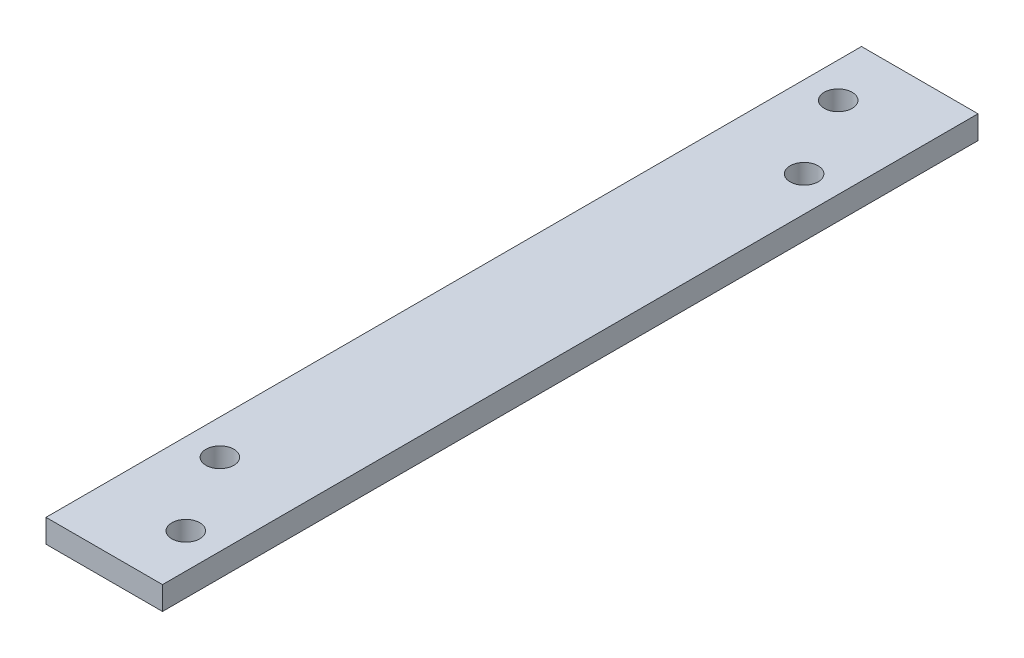
ISO-10303-21;
HEADER;
FILE_DESCRIPTION(('STEP AP214'),'2;1');
FILE_NAME('part.step','',(''),(''),'','','');
FILE_SCHEMA(('AUTOMOTIVE_DESIGN { 1 0 10303 214 1 1 1 1 }'));
ENDSEC;
DATA;
#1=APPLICATION_CONTEXT('core data for automotive mechanical design processes');
#2=APPLICATION_PROTOCOL_DEFINITION('international standard','automotive_design',2000,#1);
#3=PRODUCT_CONTEXT('',#1,'mechanical');
#4=PRODUCT('Part','Part','',(#3));
#5=PRODUCT_RELATED_PRODUCT_CATEGORY('part','',(#4));
#6=PRODUCT_DEFINITION_FORMATION('','',#4);
#7=PRODUCT_DEFINITION_CONTEXT('part definition',#1,'design');
#8=PRODUCT_DEFINITION('design','',#6,#7);
#9=PRODUCT_DEFINITION_SHAPE('','',#8);
#10=(LENGTH_UNIT() NAMED_UNIT(*) SI_UNIT(.MILLI.,.METRE.));
#11=(NAMED_UNIT(*) PLANE_ANGLE_UNIT() SI_UNIT($,.RADIAN.));
#12=(NAMED_UNIT(*) SI_UNIT($,.STERADIAN.) SOLID_ANGLE_UNIT());
#13=UNCERTAINTY_MEASURE_WITH_UNIT(LENGTH_MEASURE(1.E-05),#10,'distance_accuracy_value','');
#14=(GEOMETRIC_REPRESENTATION_CONTEXT(3) GLOBAL_UNCERTAINTY_ASSIGNED_CONTEXT((#13)) GLOBAL_UNIT_ASSIGNED_CONTEXT((#10,
#11,#12)) REPRESENTATION_CONTEXT('',''));
#15=CARTESIAN_POINT('',(0.,0.,0.));
#16=DIRECTION('',(0.,0.,1.));
#17=DIRECTION('',(1.,0.,0.));
#18=AXIS2_PLACEMENT_3D('',#15,#16,#17);
#19=CARTESIAN_POINT('',(0.,2.54,0.));
#20=DIRECTION('',(0.,-1.,0.));
#21=DIRECTION('',(0.,0.,-1.));
#22=AXIS2_PLACEMENT_3D('',#19,#20,#21);
#23=PLANE('',#22);
#24=DIRECTION('',(0.,0.,1.));
#25=VECTOR('',#24,1.);
#26=CARTESIAN_POINT('',(0.,2.54,0.));
#27=LINE('',#26,#25);
#28=CARTESIAN_POINT('',(0.,2.54,-88.9));
#29=VERTEX_POINT('',#28);
#30=CARTESIAN_POINT('',(0.,2.54,0.));
#31=VERTEX_POINT('',#30);
#32=EDGE_CURVE('E96',#29,#31,#27,.T.);
#33=ORIENTED_EDGE('',*,*,#32,.T.);
#34=DIRECTION('',(1.,0.,0.));
#35=VECTOR('',#34,1.);
#36=CARTESIAN_POINT('',(0.,2.54,0.));
#37=LINE('',#36,#35);
#38=CARTESIAN_POINT('',(12.7,2.54,0.));
#39=VERTEX_POINT('',#38);
#40=EDGE_CURVE('E91',#31,#39,#37,.T.);
#41=ORIENTED_EDGE('',*,*,#40,.T.);
#42=DIRECTION('',(0.,0.,-1.));
#43=VECTOR('',#42,1.);
#44=CARTESIAN_POINT('',(12.7,2.54,0.));
#45=LINE('',#44,#43);
#46=CARTESIAN_POINT('',(12.7,2.54,-88.9));
#47=VERTEX_POINT('',#46);
#48=EDGE_CURVE('E94',#39,#47,#45,.T.);
#49=ORIENTED_EDGE('',*,*,#48,.T.);
#50=DIRECTION('',(-1.,0.,0.));
#51=VECTOR('',#50,1.);
#52=CARTESIAN_POINT('',(0.,2.54,-88.9));
#53=LINE('',#52,#51);
#54=EDGE_CURVE('E61',#47,#29,#53,.T.);
#55=ORIENTED_EDGE('',*,*,#54,.T.);
#56=EDGE_LOOP('',(#33,#41,#49,#55));
#57=FACE_BOUND('',#56,.T.);
#58=CARTESIAN_POINT('',(3.81,2.54,-82.55));
#59=DIRECTION('',(0.,1.,0.));
#60=DIRECTION('',(0.,0.,1.));
#61=AXIS2_PLACEMENT_3D('',#58,#59,#60);
#62=CIRCLE('',#61,1.524);
#63=CARTESIAN_POINT('',(3.81,2.54,-81.026));
#64=VERTEX_POINT('',#63);
#65=EDGE_CURVE('E116',#64,#64,#62,.T.);
#66=ORIENTED_EDGE('',*,*,#65,.F.);
#67=EDGE_LOOP('',(#66));
#68=FACE_BOUND('',#67,.T.);
#69=CARTESIAN_POINT('',(8.89,2.54,-73.7511818975501));
#70=DIRECTION('',(0.,1.,0.));
#71=DIRECTION('',(0.,0.,1.));
#72=AXIS2_PLACEMENT_3D('',#69,#70,#71);
#73=CIRCLE('',#72,1.524);
#74=CARTESIAN_POINT('',(8.89,2.54,-72.2271818975501));
#75=VERTEX_POINT('',#74);
#76=EDGE_CURVE('E138',#75,#75,#73,.T.);
#77=ORIENTED_EDGE('',*,*,#76,.F.);
#78=EDGE_LOOP('',(#77));
#79=FACE_BOUND('',#78,.T.);
#80=CARTESIAN_POINT('',(8.89000000000391,2.54,-6.34999999999956));
#81=DIRECTION('',(0.,1.,0.));
#82=DIRECTION('',(0.,0.,1.));
#83=AXIS2_PLACEMENT_3D('',#80,#81,#82);
#84=CIRCLE('',#83,1.524);
#85=CARTESIAN_POINT('',(8.89000000000391,2.54,-4.82599999999957));
#86=VERTEX_POINT('',#85);
#87=EDGE_CURVE('E146',#86,#86,#84,.T.);
#88=ORIENTED_EDGE('',*,*,#87,.F.);
#89=EDGE_LOOP('',(#88));
#90=FACE_BOUND('',#89,.T.);
#91=CARTESIAN_POINT('',(3.81000000000397,2.54,-15.1488181024495));
#92=DIRECTION('',(0.,1.,0.));
#93=DIRECTION('',(0.,0.,1.));
#94=AXIS2_PLACEMENT_3D('',#91,#92,#93);
#95=CIRCLE('',#94,1.524);
#96=CARTESIAN_POINT('',(3.81000000000397,2.54,-13.6248181024495));
#97=VERTEX_POINT('',#96);
#98=EDGE_CURVE('E154',#97,#97,#95,.T.);
#99=ORIENTED_EDGE('',*,*,#98,.F.);
#100=EDGE_LOOP('',(#99));
#101=FACE_BOUND('',#100,.T.);
#102=ADVANCED_FACE('F43',(#57,#68,#79,#90,#101),#23,.F.);
#103=CARTESIAN_POINT('',(0.,0.,0.));
#104=DIRECTION('',(0.,-1.,0.));
#105=DIRECTION('',(0.,0.,-1.));
#106=AXIS2_PLACEMENT_3D('',#103,#104,#105);
#107=PLANE('',#106);
#108=CARTESIAN_POINT('',(8.89000000000391,0.,-6.34999999999956));
#109=DIRECTION('',(0.,1.,0.));
#110=DIRECTION('',(0.,0.,1.));
#111=AXIS2_PLACEMENT_3D('',#108,#109,#110);
#112=CIRCLE('',#111,1.524);
#113=CARTESIAN_POINT('',(8.89000000000391,0.,-4.82599999999957));
#114=VERTEX_POINT('',#113);
#115=EDGE_CURVE('E150',#114,#114,#112,.T.);
#116=ORIENTED_EDGE('',*,*,#115,.T.);
#117=EDGE_LOOP('',(#116));
#118=FACE_BOUND('',#117,.T.);
#119=CARTESIAN_POINT('',(3.81,0.,-82.55));
#120=DIRECTION('',(0.,1.,0.));
#121=DIRECTION('',(0.,0.,1.));
#122=AXIS2_PLACEMENT_3D('',#119,#120,#121);
#123=CIRCLE('',#122,1.524);
#124=CARTESIAN_POINT('',(3.81,0.,-81.026));
#125=VERTEX_POINT('',#124);
#126=EDGE_CURVE('E134',#125,#125,#123,.T.);
#127=ORIENTED_EDGE('',*,*,#126,.T.);
#128=EDGE_LOOP('',(#127));
#129=FACE_BOUND('',#128,.T.);
#130=DIRECTION('',(0.,0.,1.));
#131=VECTOR('',#130,1.);
#132=CARTESIAN_POINT('',(0.,0.,0.));
#133=LINE('',#132,#131);
#134=CARTESIAN_POINT('',(0.,0.,-88.9));
#135=VERTEX_POINT('',#134);
#136=CARTESIAN_POINT('',(0.,0.,0.));
#137=VERTEX_POINT('',#136);
#138=EDGE_CURVE('E112',#135,#137,#133,.T.);
#139=ORIENTED_EDGE('',*,*,#138,.F.);
#140=DIRECTION('',(-1.,0.,0.));
#141=VECTOR('',#140,1.);
#142=CARTESIAN_POINT('',(0.,0.,-88.9));
#143=LINE('',#142,#141);
#144=CARTESIAN_POINT('',(12.7,0.,-88.9));
#145=VERTEX_POINT('',#144);
#146=EDGE_CURVE('E84',#145,#135,#143,.T.);
#147=ORIENTED_EDGE('',*,*,#146,.F.);
#148=DIRECTION('',(0.,0.,-1.));
#149=VECTOR('',#148,1.);
#150=CARTESIAN_POINT('',(12.7,0.,0.));
#151=LINE('',#150,#149);
#152=CARTESIAN_POINT('',(12.7,0.,0.));
#153=VERTEX_POINT('',#152);
#154=EDGE_CURVE('E78',#153,#145,#151,.T.);
#155=ORIENTED_EDGE('',*,*,#154,.F.);
#156=DIRECTION('',(1.,0.,0.));
#157=VECTOR('',#156,1.);
#158=CARTESIAN_POINT('',(0.,0.,0.));
#159=LINE('',#158,#157);
#160=EDGE_CURVE('E101',#137,#153,#159,.T.);
#161=ORIENTED_EDGE('',*,*,#160,.F.);
#162=EDGE_LOOP('',(#139,#147,#155,#161));
#163=FACE_BOUND('',#162,.T.);
#164=CARTESIAN_POINT('',(8.89,0.,-73.7511818975501));
#165=DIRECTION('',(0.,1.,0.));
#166=DIRECTION('',(0.,0.,1.));
#167=AXIS2_PLACEMENT_3D('',#164,#165,#166);
#168=CIRCLE('',#167,1.524);
#169=CARTESIAN_POINT('',(8.89,0.,-72.2271818975501));
#170=VERTEX_POINT('',#169);
#171=EDGE_CURVE('E142',#170,#170,#168,.T.);
#172=ORIENTED_EDGE('',*,*,#171,.T.);
#173=EDGE_LOOP('',(#172));
#174=FACE_BOUND('',#173,.T.);
#175=CARTESIAN_POINT('',(3.81000000000397,0.,-15.1488181024495));
#176=DIRECTION('',(0.,1.,0.));
#177=DIRECTION('',(0.,0.,1.));
#178=AXIS2_PLACEMENT_3D('',#175,#176,#177);
#179=CIRCLE('',#178,1.524);
#180=CARTESIAN_POINT('',(3.81000000000397,0.,-13.6248181024495));
#181=VERTEX_POINT('',#180);
#182=EDGE_CURVE('E158',#181,#181,#179,.T.);
#183=ORIENTED_EDGE('',*,*,#182,.T.);
#184=EDGE_LOOP('',(#183));
#185=FACE_BOUND('',#184,.T.);
#186=ADVANCED_FACE('F129',(#118,#129,#163,#174,#185),#107,.T.);
#187=CARTESIAN_POINT('',(0.,2.54,0.));
#188=DIRECTION('',(1.,0.,0.));
#189=DIRECTION('',(0.,0.,-1.));
#190=AXIS2_PLACEMENT_3D('',#187,#188,#189);
#191=PLANE('',#190);
#192=ORIENTED_EDGE('',*,*,#138,.T.);
#193=DIRECTION('',(0.,-1.,0.));
#194=VECTOR('',#193,1.);
#195=CARTESIAN_POINT('',(0.,2.54,0.));
#196=LINE('',#195,#194);
#197=EDGE_CURVE('E11',#31,#137,#196,.T.);
#198=ORIENTED_EDGE('',*,*,#197,.F.);
#199=ORIENTED_EDGE('',*,*,#32,.F.);
#200=DIRECTION('',(0.,-1.,0.));
#201=VECTOR('',#200,1.);
#202=CARTESIAN_POINT('',(0.,2.54,-88.9));
#203=LINE('',#202,#201);
#204=EDGE_CURVE('E108',#29,#135,#203,.T.);
#205=ORIENTED_EDGE('',*,*,#204,.T.);
#206=EDGE_LOOP('',(#192,#198,#199,#205));
#207=FACE_BOUND('',#206,.T.);
#208=ADVANCED_FACE('F45',(#207),#191,.F.);
#209=CARTESIAN_POINT('',(0.,2.54,0.));
#210=DIRECTION('',(0.,0.,-1.));
#211=DIRECTION('',(-1.,0.,0.));
#212=AXIS2_PLACEMENT_3D('',#209,#210,#211);
#213=PLANE('',#212);
#214=ORIENTED_EDGE('',*,*,#160,.T.);
#215=DIRECTION('',(0.,-1.,0.));
#216=VECTOR('',#215,1.);
#217=CARTESIAN_POINT('',(12.7,2.54,0.));
#218=LINE('',#217,#216);
#219=EDGE_CURVE('E53',#39,#153,#218,.T.);
#220=ORIENTED_EDGE('',*,*,#219,.F.);
#221=ORIENTED_EDGE('',*,*,#40,.F.);
#222=ORIENTED_EDGE('',*,*,#197,.T.);
#223=EDGE_LOOP('',(#214,#220,#221,#222));
#224=FACE_BOUND('',#223,.T.);
#225=ADVANCED_FACE('F100',(#224),#213,.F.);
#226=CARTESIAN_POINT('',(12.7,2.54,0.));
#227=DIRECTION('',(-1.,0.,0.));
#228=DIRECTION('',(0.,0.,1.));
#229=AXIS2_PLACEMENT_3D('',#226,#227,#228);
#230=PLANE('',#229);
#231=ORIENTED_EDGE('',*,*,#154,.T.);
#232=DIRECTION('',(0.,-1.,0.));
#233=VECTOR('',#232,1.);
#234=CARTESIAN_POINT('',(12.7,2.54,-88.9));
#235=LINE('',#234,#233);
#236=EDGE_CURVE('E103',#47,#145,#235,.T.);
#237=ORIENTED_EDGE('',*,*,#236,.F.);
#238=ORIENTED_EDGE('',*,*,#48,.F.);
#239=ORIENTED_EDGE('',*,*,#219,.T.);
#240=EDGE_LOOP('',(#231,#237,#238,#239));
#241=FACE_BOUND('',#240,.T.);
#242=ADVANCED_FACE('F104',(#241),#230,.F.);
#243=CARTESIAN_POINT('',(0.,2.54,-88.9));
#244=DIRECTION('',(0.,0.,1.));
#245=DIRECTION('',(1.,0.,0.));
#246=AXIS2_PLACEMENT_3D('',#243,#244,#245);
#247=PLANE('',#246);
#248=ORIENTED_EDGE('',*,*,#146,.T.);
#249=ORIENTED_EDGE('',*,*,#204,.F.);
#250=ORIENTED_EDGE('',*,*,#54,.F.);
#251=ORIENTED_EDGE('',*,*,#236,.T.);
#252=EDGE_LOOP('',(#248,#249,#250,#251));
#253=FACE_BOUND('',#252,.T.);
#254=ADVANCED_FACE('F126',(#253),#247,.F.);
#255=CARTESIAN_POINT('',(3.81,2.54,-82.55));
#256=DIRECTION('',(0.,-1.,0.));
#257=DIRECTION('',(0.,0.,-1.));
#258=AXIS2_PLACEMENT_3D('',#255,#256,#257);
#259=CYLINDRICAL_SURFACE('',#258,1.524);
#260=ORIENTED_EDGE('',*,*,#65,.T.);
#261=EDGE_LOOP('',(#260));
#262=FACE_BOUND('',#261,.T.);
#263=ORIENTED_EDGE('',*,*,#126,.F.);
#264=EDGE_LOOP('',(#263));
#265=FACE_BOUND('',#264,.T.);
#266=ADVANCED_FACE('F177',(#262,#265),#259,.F.);
#267=CARTESIAN_POINT('',(8.89,2.54,-73.7511818975501));
#268=DIRECTION('',(0.,-1.,0.));
#269=DIRECTION('',(0.,0.,-1.));
#270=AXIS2_PLACEMENT_3D('',#267,#268,#269);
#271=CYLINDRICAL_SURFACE('',#270,1.524);
#272=ORIENTED_EDGE('',*,*,#76,.T.);
#273=EDGE_LOOP('',(#272));
#274=FACE_BOUND('',#273,.T.);
#275=ORIENTED_EDGE('',*,*,#171,.F.);
#276=EDGE_LOOP('',(#275));
#277=FACE_BOUND('',#276,.T.);
#278=ADVANCED_FACE('F231',(#274,#277),#271,.F.);
#279=CARTESIAN_POINT('',(8.89000000000391,2.54,-6.34999999999956));
#280=DIRECTION('',(0.,-1.,0.));
#281=DIRECTION('',(0.,0.,-1.));
#282=AXIS2_PLACEMENT_3D('',#279,#280,#281);
#283=CYLINDRICAL_SURFACE('',#282,1.524);
#284=ORIENTED_EDGE('',*,*,#87,.T.);
#285=EDGE_LOOP('',(#284));
#286=FACE_BOUND('',#285,.T.);
#287=ORIENTED_EDGE('',*,*,#115,.F.);
#288=EDGE_LOOP('',(#287));
#289=FACE_BOUND('',#288,.T.);
#290=ADVANCED_FACE('F240',(#286,#289),#283,.F.);
#291=CARTESIAN_POINT('',(3.81000000000397,2.54,-15.1488181024495));
#292=DIRECTION('',(0.,-1.,0.));
#293=DIRECTION('',(0.,0.,-1.));
#294=AXIS2_PLACEMENT_3D('',#291,#292,#293);
#295=CYLINDRICAL_SURFACE('',#294,1.524);
#296=ORIENTED_EDGE('',*,*,#98,.T.);
#297=EDGE_LOOP('',(#296));
#298=FACE_BOUND('',#297,.T.);
#299=ORIENTED_EDGE('',*,*,#182,.F.);
#300=EDGE_LOOP('',(#299));
#301=FACE_BOUND('',#300,.T.);
#302=ADVANCED_FACE('F166',(#298,#301),#295,.F.);
#303=CLOSED_SHELL('',(#102,#186,#208,#225,#242,#254,#266,#278,#290,#302));
#304=MANIFOLD_SOLID_BREP('B2',#303);
#305=ADVANCED_BREP_SHAPE_REPRESENTATION('',(#18,#304),#14);
#306=SHAPE_DEFINITION_REPRESENTATION(#9,#305);
ENDSEC;
END-ISO-10303-21;
